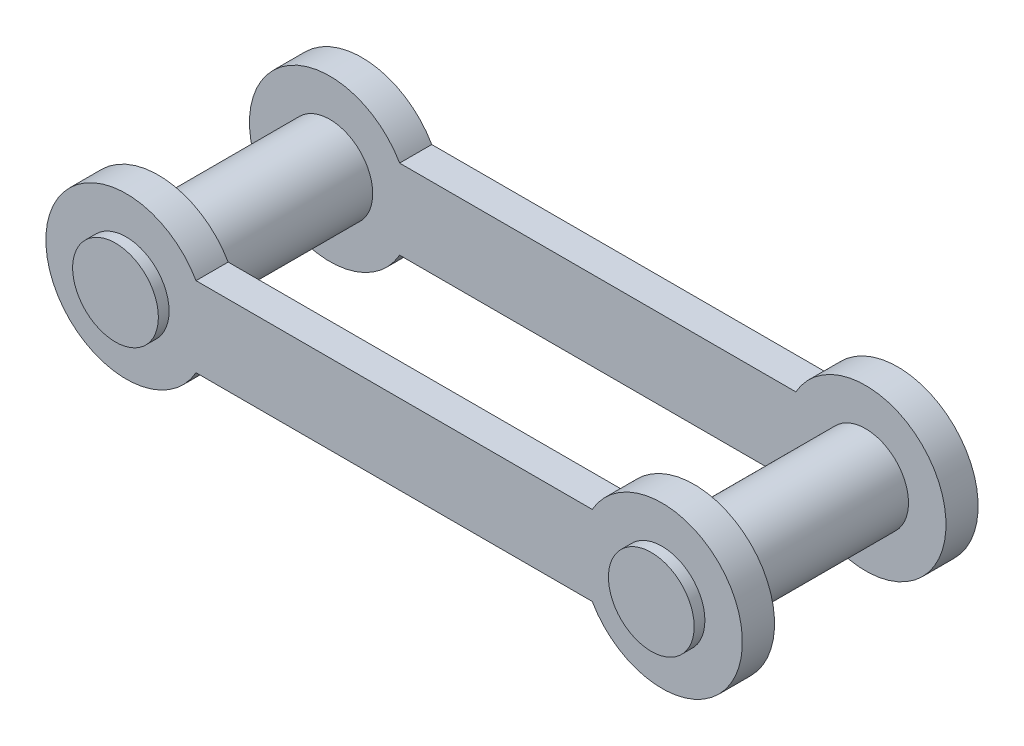
ISO-10303-21;
HEADER;
FILE_DESCRIPTION(('STEP AP214'),'2;1');
FILE_NAME('part.step','',(''),(''),'','','');
FILE_SCHEMA(('AUTOMOTIVE_DESIGN { 1 0 10303 214 1 1 1 1 }'));
ENDSEC;
DATA;
#1=APPLICATION_CONTEXT('core data for automotive mechanical design processes');
#2=APPLICATION_PROTOCOL_DEFINITION('international standard','automotive_design',2000,#1);
#3=PRODUCT_CONTEXT('',#1,'mechanical');
#4=PRODUCT('Part','Part','',(#3));
#5=PRODUCT_RELATED_PRODUCT_CATEGORY('part','',(#4));
#6=PRODUCT_DEFINITION_FORMATION('','',#4);
#7=PRODUCT_DEFINITION_CONTEXT('part definition',#1,'design');
#8=PRODUCT_DEFINITION('design','',#6,#7);
#9=PRODUCT_DEFINITION_SHAPE('','',#8);
#10=(LENGTH_UNIT() NAMED_UNIT(*) SI_UNIT(.MILLI.,.METRE.));
#11=(NAMED_UNIT(*) PLANE_ANGLE_UNIT() SI_UNIT($,.RADIAN.));
#12=(NAMED_UNIT(*) SI_UNIT($,.STERADIAN.) SOLID_ANGLE_UNIT());
#13=UNCERTAINTY_MEASURE_WITH_UNIT(LENGTH_MEASURE(1.E-05),#10,'distance_accuracy_value','');
#14=(GEOMETRIC_REPRESENTATION_CONTEXT(3) GLOBAL_UNCERTAINTY_ASSIGNED_CONTEXT((#13)) GLOBAL_UNIT_ASSIGNED_CONTEXT((#10,
#11,#12)) REPRESENTATION_CONTEXT('',''));
#15=CARTESIAN_POINT('',(0.,0.,0.));
#16=DIRECTION('',(0.,0.,1.));
#17=DIRECTION('',(1.,0.,0.));
#18=AXIS2_PLACEMENT_3D('',#15,#16,#17);
#19=CARTESIAN_POINT('',(-13.0392428409477,1.73580037842723,3.));
#20=DIRECTION('',(0.,0.,1.));
#21=DIRECTION('',(1.,0.,0.));
#22=AXIS2_PLACEMENT_3D('',#19,#20,#21);
#23=PLANE('',#22);
#24=CARTESIAN_POINT('',(-13.0392428409477,1.73580037842723,3.));
#25=DIRECTION('',(0.,0.,1.));
#26=DIRECTION('',(1.,0.,0.));
#27=AXIS2_PLACEMENT_3D('',#24,#25,#26);
#28=CIRCLE('',#27,4.);
#29=CARTESIAN_POINT('',(-9.03924284094771,1.73580037842723,3.));
#30=VERTEX_POINT('',#29);
#31=EDGE_CURVE('E175',#30,#30,#28,.T.);
#32=ORIENTED_EDGE('',*,*,#31,.F.);
#33=EDGE_LOOP('',(#32));
#34=FACE_BOUND('',#33,.T.);
#35=CARTESIAN_POINT('',(-13.0392428409477,1.73580037842723,3.));
#36=DIRECTION('',(0.,0.,1.));
#37=DIRECTION('',(1.,0.,0.));
#38=AXIS2_PLACEMENT_3D('',#35,#36,#37);
#39=CIRCLE('',#38,7.50000000000001);
#40=CARTESIAN_POINT('',(-6.52657961034547,5.45537261791416,3.));
#41=VERTEX_POINT('',#40);
#42=CARTESIAN_POINT('',(-6.52657961034548,-1.98377186105969,3.));
#43=VERTEX_POINT('',#42);
#44=EDGE_CURVE('E179',#41,#43,#39,.T.);
#45=ORIENTED_EDGE('',*,*,#44,.T.);
#46=DIRECTION('',(1.,0.,0.));
#47=VECTOR('',#46,1.);
#48=CARTESIAN_POINT('',(-6.52657961034548,-1.98377186105969,3.));
#49=LINE('',#48,#47);
#50=CARTESIAN_POINT('',(30.4480939284501,-1.98377186105969,3.));
#51=VERTEX_POINT('',#50);
#52=EDGE_CURVE('E83',#43,#51,#49,.T.);
#53=ORIENTED_EDGE('',*,*,#52,.T.);
#54=CARTESIAN_POINT('',(36.9607571590523,1.73580037842723,3.));
#55=DIRECTION('',(0.,0.,1.));
#56=DIRECTION('',(-1.,0.,0.));
#57=AXIS2_PLACEMENT_3D('',#54,#55,#56);
#58=CIRCLE('',#57,7.50000000000001);
#59=CARTESIAN_POINT('',(30.4480939284501,5.45537261791416,3.));
#60=VERTEX_POINT('',#59);
#61=EDGE_CURVE('E182',#51,#60,#58,.T.);
#62=ORIENTED_EDGE('',*,*,#61,.T.);
#63=DIRECTION('',(-1.,0.,0.));
#64=VECTOR('',#63,1.);
#65=CARTESIAN_POINT('',(-6.52657961034547,5.45537261791416,3.));
#66=LINE('',#65,#64);
#67=EDGE_CURVE('E51',#60,#41,#66,.T.);
#68=ORIENTED_EDGE('',*,*,#67,.T.);
#69=EDGE_LOOP('',(#45,#53,#62,#68));
#70=FACE_BOUND('',#69,.T.);
#71=CARTESIAN_POINT('',(36.9607571590523,1.73580037842723,3.));
#72=DIRECTION('',(0.,0.,1.));
#73=DIRECTION('',(-1.,0.,0.));
#74=AXIS2_PLACEMENT_3D('',#71,#72,#73);
#75=CIRCLE('',#74,4.);
#76=CARTESIAN_POINT('',(32.9607571590523,1.73580037842723,3.));
#77=VERTEX_POINT('',#76);
#78=EDGE_CURVE('E172',#77,#77,#75,.T.);
#79=ORIENTED_EDGE('',*,*,#78,.F.);
#80=EDGE_LOOP('',(#79));
#81=FACE_BOUND('',#80,.T.);
#82=ADVANCED_FACE('F34',(#34,#70,#81),#23,.T.);
#83=CARTESIAN_POINT('',(-13.0392428409477,1.73580037842723,0.));
#84=DIRECTION('',(0.,0.,1.));
#85=DIRECTION('',(1.,0.,0.));
#86=AXIS2_PLACEMENT_3D('',#83,#84,#85);
#87=PLANE('',#86);
#88=CARTESIAN_POINT('',(-13.0392428409477,1.73580037842723,0.));
#89=DIRECTION('',(0.,0.,1.));
#90=DIRECTION('',(1.,0.,0.));
#91=AXIS2_PLACEMENT_3D('',#88,#89,#90);
#92=CIRCLE('',#91,7.50000000000001);
#93=CARTESIAN_POINT('',(-6.52657961034547,5.45537261791416,0.));
#94=VERTEX_POINT('',#93);
#95=CARTESIAN_POINT('',(-6.52657961034548,-1.98377186105969,0.));
#96=VERTEX_POINT('',#95);
#97=EDGE_CURVE('E178',#94,#96,#92,.T.);
#98=ORIENTED_EDGE('',*,*,#97,.F.);
#99=DIRECTION('',(-1.,0.,0.));
#100=VECTOR('',#99,1.);
#101=CARTESIAN_POINT('',(-6.52657961034547,5.45537261791416,0.));
#102=LINE('',#101,#100);
#103=CARTESIAN_POINT('',(30.4480939284501,5.45537261791416,0.));
#104=VERTEX_POINT('',#103);
#105=EDGE_CURVE('E75',#104,#94,#102,.T.);
#106=ORIENTED_EDGE('',*,*,#105,.F.);
#107=CARTESIAN_POINT('',(36.9607571590523,1.73580037842723,0.));
#108=DIRECTION('',(0.,0.,1.));
#109=DIRECTION('',(-1.,0.,0.));
#110=AXIS2_PLACEMENT_3D('',#107,#108,#109);
#111=CIRCLE('',#110,7.50000000000001);
#112=CARTESIAN_POINT('',(30.4480939284501,-1.98377186105969,0.));
#113=VERTEX_POINT('',#112);
#114=EDGE_CURVE('E69',#113,#104,#111,.T.);
#115=ORIENTED_EDGE('',*,*,#114,.F.);
#116=DIRECTION('',(1.,0.,0.));
#117=VECTOR('',#116,1.);
#118=CARTESIAN_POINT('',(-6.52657961034548,-1.98377186105969,0.));
#119=LINE('',#118,#117);
#120=EDGE_CURVE('E188',#96,#113,#119,.T.);
#121=ORIENTED_EDGE('',*,*,#120,.F.);
#122=EDGE_LOOP('',(#98,#106,#115,#121));
#123=FACE_BOUND('',#122,.T.);
#124=CARTESIAN_POINT('',(-13.0392428409477,1.73580037842723,0.));
#125=DIRECTION('',(0.,0.,1.));
#126=DIRECTION('',(1.,0.,0.));
#127=AXIS2_PLACEMENT_3D('',#124,#125,#126);
#128=CIRCLE('',#127,4.);
#129=CARTESIAN_POINT('',(-9.03924284094771,1.73580037842723,0.));
#130=VERTEX_POINT('',#129);
#131=EDGE_CURVE('E169',#130,#130,#128,.T.);
#132=ORIENTED_EDGE('',*,*,#131,.T.);
#133=EDGE_LOOP('',(#132));
#134=FACE_BOUND('',#133,.T.);
#135=CARTESIAN_POINT('',(36.9607571590523,1.73580037842723,0.));
#136=DIRECTION('',(0.,0.,1.));
#137=DIRECTION('',(1.,0.,0.));
#138=AXIS2_PLACEMENT_3D('',#135,#136,#137);
#139=CIRCLE('',#138,4.);
#140=CARTESIAN_POINT('',(40.9607571590523,1.73580037842723,0.));
#141=VERTEX_POINT('',#140);
#142=EDGE_CURVE('E160',#141,#141,#139,.T.);
#143=ORIENTED_EDGE('',*,*,#142,.T.);
#144=EDGE_LOOP('',(#143));
#145=FACE_BOUND('',#144,.T.);
#146=ADVANCED_FACE('F212',(#123,#134,#145),#87,.F.);
#147=CARTESIAN_POINT('',(-13.0392428409477,1.73580037842723,3.));
#148=DIRECTION('',(0.,0.,-1.));
#149=DIRECTION('',(-1.,0.,0.));
#150=AXIS2_PLACEMENT_3D('',#147,#148,#149);
#151=CYLINDRICAL_SURFACE('',#150,7.50000000000001);
#152=ORIENTED_EDGE('',*,*,#97,.T.);
#153=DIRECTION('',(0.,0.,-1.));
#154=VECTOR('',#153,1.);
#155=CARTESIAN_POINT('',(-6.52657961034548,-1.98377186105969,3.));
#156=LINE('',#155,#154);
#157=EDGE_CURVE('E197',#43,#96,#156,.T.);
#158=ORIENTED_EDGE('',*,*,#157,.F.);
#159=ORIENTED_EDGE('',*,*,#44,.F.);
#160=DIRECTION('',(0.,0.,-1.));
#161=VECTOR('',#160,1.);
#162=CARTESIAN_POINT('',(-6.52657961034547,5.45537261791416,3.));
#163=LINE('',#162,#161);
#164=EDGE_CURVE('E185',#41,#94,#163,.T.);
#165=ORIENTED_EDGE('',*,*,#164,.T.);
#166=EDGE_LOOP('',(#152,#158,#159,#165));
#167=FACE_BOUND('',#166,.T.);
#168=ADVANCED_FACE('F36',(#167),#151,.T.);
#169=CARTESIAN_POINT('',(-6.52657961034548,-1.98377186105969,3.));
#170=DIRECTION('',(0.,1.,0.));
#171=DIRECTION('',(0.,0.,1.));
#172=AXIS2_PLACEMENT_3D('',#169,#170,#171);
#173=PLANE('',#172);
#174=ORIENTED_EDGE('',*,*,#120,.T.);
#175=DIRECTION('',(0.,0.,-1.));
#176=VECTOR('',#175,1.);
#177=CARTESIAN_POINT('',(30.4480939284501,-1.98377186105969,3.));
#178=LINE('',#177,#176);
#179=EDGE_CURVE('E195',#51,#113,#178,.T.);
#180=ORIENTED_EDGE('',*,*,#179,.F.);
#181=ORIENTED_EDGE('',*,*,#52,.F.);
#182=ORIENTED_EDGE('',*,*,#157,.T.);
#183=EDGE_LOOP('',(#174,#180,#181,#182));
#184=FACE_BOUND('',#183,.T.);
#185=ADVANCED_FACE('F231',(#184),#173,.F.);
#186=CARTESIAN_POINT('',(36.9607571590523,1.73580037842723,3.));
#187=DIRECTION('',(0.,0.,-1.));
#188=DIRECTION('',(-1.,0.,0.));
#189=AXIS2_PLACEMENT_3D('',#186,#187,#188);
#190=CYLINDRICAL_SURFACE('',#189,7.50000000000001);
#191=ORIENTED_EDGE('',*,*,#114,.T.);
#192=DIRECTION('',(0.,0.,-1.));
#193=VECTOR('',#192,1.);
#194=CARTESIAN_POINT('',(30.4480939284501,5.45537261791416,3.));
#195=LINE('',#194,#193);
#196=EDGE_CURVE('E193',#60,#104,#195,.T.);
#197=ORIENTED_EDGE('',*,*,#196,.F.);
#198=ORIENTED_EDGE('',*,*,#61,.F.);
#199=ORIENTED_EDGE('',*,*,#179,.T.);
#200=EDGE_LOOP('',(#191,#197,#198,#199));
#201=FACE_BOUND('',#200,.T.);
#202=ADVANCED_FACE('F229',(#201),#190,.T.);
#203=CARTESIAN_POINT('',(-6.52657961034547,5.45537261791416,3.));
#204=DIRECTION('',(0.,-1.,0.));
#205=DIRECTION('',(0.,0.,-1.));
#206=AXIS2_PLACEMENT_3D('',#203,#204,#205);
#207=PLANE('',#206);
#208=ORIENTED_EDGE('',*,*,#105,.T.);
#209=ORIENTED_EDGE('',*,*,#164,.F.);
#210=ORIENTED_EDGE('',*,*,#67,.F.);
#211=ORIENTED_EDGE('',*,*,#196,.T.);
#212=EDGE_LOOP('',(#208,#209,#210,#211));
#213=FACE_BOUND('',#212,.T.);
#214=ADVANCED_FACE('F225',(#213),#207,.F.);
#215=CARTESIAN_POINT('',(-13.0392428409477,1.73580037842723,-1.));
#216=DIRECTION('',(0.,0.,1.));
#217=DIRECTION('',(1.,0.,0.));
#218=AXIS2_PLACEMENT_3D('',#215,#216,#217);
#219=PLANE('',#218);
#220=CARTESIAN_POINT('',(-13.0392428409477,1.73580037842723,-1.));
#221=DIRECTION('',(0.,0.,1.));
#222=DIRECTION('',(1.,0.,0.));
#223=AXIS2_PLACEMENT_3D('',#220,#221,#222);
#224=CIRCLE('',#223,4.);
#225=CARTESIAN_POINT('',(-9.03924284094771,1.73580037842723,-1.));
#226=VERTEX_POINT('',#225);
#227=EDGE_CURVE('E166',#226,#226,#224,.T.);
#228=ORIENTED_EDGE('',*,*,#227,.F.);
#229=EDGE_LOOP('',(#228));
#230=FACE_BOUND('',#229,.T.);
#231=ADVANCED_FACE('F228',(#230),#219,.F.);
#232=CARTESIAN_POINT('',(-13.0392428409477,1.73580037842723,-1.));
#233=DIRECTION('',(0.,0.,1.));
#234=DIRECTION('',(1.,0.,0.));
#235=AXIS2_PLACEMENT_3D('',#232,#233,#234);
#236=CYLINDRICAL_SURFACE('',#235,4.);
#237=ORIENTED_EDGE('',*,*,#227,.T.);
#238=EDGE_LOOP('',(#237));
#239=FACE_BOUND('',#238,.T.);
#240=ORIENTED_EDGE('',*,*,#131,.F.);
#241=EDGE_LOOP('',(#240));
#242=FACE_BOUND('',#241,.T.);
#243=ADVANCED_FACE('F338',(#239,#242),#236,.T.);
#244=CARTESIAN_POINT('',(-13.0392428409477,1.73580037842723,19.));
#245=DIRECTION('',(0.,0.,-1.));
#246=DIRECTION('',(-1.,0.,0.));
#247=AXIS2_PLACEMENT_3D('',#244,#245,#246);
#248=CIRCLE('',#247,4.);
#249=CARTESIAN_POINT('',(-17.0392428409477,1.73580037842723,19.));
#250=VERTEX_POINT('',#249);
#251=EDGE_CURVE('E11',#250,#250,#248,.F.);
#252=ORIENTED_EDGE('',*,*,#251,.F.);
#253=EDGE_LOOP('',(#252));
#254=FACE_BOUND('',#253,.T.);
#255=ORIENTED_EDGE('',*,*,#31,.T.);
#256=EDGE_LOOP('',(#255));
#257=FACE_BOUND('',#256,.T.);
#258=ADVANCED_FACE('F222',(#254,#257),#236,.T.);
#259=CARTESIAN_POINT('',(36.9607571590523,1.73580037842723,-1.));
#260=DIRECTION('',(0.,0.,1.));
#261=DIRECTION('',(1.,0.,0.));
#262=AXIS2_PLACEMENT_3D('',#259,#260,#261);
#263=PLANE('',#262);
#264=CARTESIAN_POINT('',(36.9607571590523,1.73580037842723,-1.));
#265=DIRECTION('',(0.,0.,1.));
#266=DIRECTION('',(1.,0.,0.));
#267=AXIS2_PLACEMENT_3D('',#264,#265,#266);
#268=CIRCLE('',#267,4.);
#269=CARTESIAN_POINT('',(40.9607571590523,1.73580037842723,-1.));
#270=VERTEX_POINT('',#269);
#271=EDGE_CURVE('E157',#270,#270,#268,.T.);
#272=ORIENTED_EDGE('',*,*,#271,.F.);
#273=EDGE_LOOP('',(#272));
#274=FACE_BOUND('',#273,.T.);
#275=ADVANCED_FACE('F247',(#274),#263,.F.);
#276=CARTESIAN_POINT('',(36.9607571590523,1.73580037842723,-1.));
#277=DIRECTION('',(0.,0.,1.));
#278=DIRECTION('',(1.,0.,0.));
#279=AXIS2_PLACEMENT_3D('',#276,#277,#278);
#280=CYLINDRICAL_SURFACE('',#279,4.);
#281=ORIENTED_EDGE('',*,*,#271,.T.);
#282=EDGE_LOOP('',(#281));
#283=FACE_BOUND('',#282,.T.);
#284=ORIENTED_EDGE('',*,*,#142,.F.);
#285=EDGE_LOOP('',(#284));
#286=FACE_BOUND('',#285,.T.);
#287=ADVANCED_FACE('F206',(#283,#286),#280,.T.);
#288=CARTESIAN_POINT('',(36.9607571590523,1.73580037842723,19.));
#289=DIRECTION('',(0.,0.,-1.));
#290=DIRECTION('',(-1.,0.,0.));
#291=AXIS2_PLACEMENT_3D('',#288,#289,#290);
#292=CIRCLE('',#291,4.);
#293=CARTESIAN_POINT('',(32.9607571590523,1.73580037842723,19.));
#294=VERTEX_POINT('',#293);
#295=EDGE_CURVE('E43',#294,#294,#292,.F.);
#296=ORIENTED_EDGE('',*,*,#295,.F.);
#297=EDGE_LOOP('',(#296));
#298=FACE_BOUND('',#297,.T.);
#299=ORIENTED_EDGE('',*,*,#78,.T.);
#300=EDGE_LOOP('',(#299));
#301=FACE_BOUND('',#300,.T.);
#302=ADVANCED_FACE('F203',(#298,#301),#280,.T.);
#303=CARTESIAN_POINT('',(-13.0392428409477,1.73580037842723,19.));
#304=DIRECTION('',(0.,0.,1.));
#305=DIRECTION('',(1.,0.,0.));
#306=AXIS2_PLACEMENT_3D('',#303,#304,#305);
#307=CYLINDRICAL_SURFACE('',#306,7.50000000000001);
#308=CARTESIAN_POINT('',(-13.0392428409477,1.73580037842723,22.));
#309=DIRECTION('',(0.,0.,1.));
#310=DIRECTION('',(1.,0.,0.));
#311=AXIS2_PLACEMENT_3D('',#308,#309,#310);
#312=CIRCLE('',#311,7.50000000000001);
#313=CARTESIAN_POINT('',(-6.52657961034547,5.45537261791416,22.));
#314=VERTEX_POINT('',#313);
#315=CARTESIAN_POINT('',(-6.52657961034548,-1.98377186105969,22.));
#316=VERTEX_POINT('',#315);
#317=EDGE_CURVE('E116',#314,#316,#312,.T.);
#318=ORIENTED_EDGE('',*,*,#317,.F.);
#319=DIRECTION('',(0.,0.,1.));
#320=VECTOR('',#319,1.);
#321=CARTESIAN_POINT('',(-6.52657961034547,5.45537261791416,19.));
#322=LINE('',#321,#320);
#323=CARTESIAN_POINT('',(-6.52657961034547,5.45537261791416,19.));
#324=VERTEX_POINT('',#323);
#325=EDGE_CURVE('E110',#324,#314,#322,.T.);
#326=ORIENTED_EDGE('',*,*,#325,.F.);
#327=CARTESIAN_POINT('',(-13.0392428409477,1.73580037842723,19.));
#328=DIRECTION('',(0.,0.,1.));
#329=DIRECTION('',(1.,0.,0.));
#330=AXIS2_PLACEMENT_3D('',#327,#328,#329);
#331=CIRCLE('',#330,7.50000000000001);
#332=CARTESIAN_POINT('',(-6.52657961034548,-1.98377186105969,19.));
#333=VERTEX_POINT('',#332);
#334=EDGE_CURVE('E113',#324,#333,#331,.T.);
#335=ORIENTED_EDGE('',*,*,#334,.T.);
#336=DIRECTION('',(0.,0.,1.));
#337=VECTOR('',#336,1.);
#338=CARTESIAN_POINT('',(-6.52657961034548,-1.98377186105969,19.));
#339=LINE('',#338,#337);
#340=EDGE_CURVE('E141',#333,#316,#339,.T.);
#341=ORIENTED_EDGE('',*,*,#340,.T.);
#342=EDGE_LOOP('',(#318,#326,#335,#341));
#343=FACE_BOUND('',#342,.T.);
#344=ADVANCED_FACE('F112',(#343),#307,.T.);
#345=CARTESIAN_POINT('',(-6.52657961034547,5.45537261791416,19.));
#346=DIRECTION('',(0.,1.,0.));
#347=DIRECTION('',(0.,0.,1.));
#348=AXIS2_PLACEMENT_3D('',#345,#346,#347);
#349=PLANE('',#348);
#350=DIRECTION('',(-1.,0.,0.));
#351=VECTOR('',#350,1.);
#352=CARTESIAN_POINT('',(-6.52657961034547,5.45537261791416,22.));
#353=LINE('',#352,#351);
#354=CARTESIAN_POINT('',(30.4480939284501,5.45537261791416,22.));
#355=VERTEX_POINT('',#354);
#356=EDGE_CURVE('E143',#355,#314,#353,.T.);
#357=ORIENTED_EDGE('',*,*,#356,.F.);
#358=DIRECTION('',(0.,0.,1.));
#359=VECTOR('',#358,1.);
#360=CARTESIAN_POINT('',(30.4480939284501,5.45537261791416,19.));
#361=LINE('',#360,#359);
#362=CARTESIAN_POINT('',(30.4480939284501,5.45537261791416,19.));
#363=VERTEX_POINT('',#362);
#364=EDGE_CURVE('E122',#363,#355,#361,.T.);
#365=ORIENTED_EDGE('',*,*,#364,.F.);
#366=DIRECTION('',(-1.,0.,0.));
#367=VECTOR('',#366,1.);
#368=CARTESIAN_POINT('',(-6.52657961034547,5.45537261791416,19.));
#369=LINE('',#368,#367);
#370=EDGE_CURVE('E128',#363,#324,#369,.T.);
#371=ORIENTED_EDGE('',*,*,#370,.T.);
#372=ORIENTED_EDGE('',*,*,#325,.T.);
#373=EDGE_LOOP('',(#357,#365,#371,#372));
#374=FACE_BOUND('',#373,.T.);
#375=ADVANCED_FACE('F134',(#374),#349,.T.);
#376=CARTESIAN_POINT('',(36.9607571590523,1.73580037842723,19.));
#377=DIRECTION('',(0.,0.,1.));
#378=DIRECTION('',(1.,0.,0.));
#379=AXIS2_PLACEMENT_3D('',#376,#377,#378);
#380=CYLINDRICAL_SURFACE('',#379,7.50000000000001);
#381=CARTESIAN_POINT('',(36.9607571590523,1.73580037842723,22.));
#382=DIRECTION('',(0.,0.,1.));
#383=DIRECTION('',(-1.,0.,0.));
#384=AXIS2_PLACEMENT_3D('',#381,#382,#383);
#385=CIRCLE('',#384,7.50000000000001);
#386=CARTESIAN_POINT('',(30.4480939284501,-1.98377186105969,22.));
#387=VERTEX_POINT('',#386);
#388=EDGE_CURVE('E146',#387,#355,#385,.T.);
#389=ORIENTED_EDGE('',*,*,#388,.F.);
#390=DIRECTION('',(0.,0.,1.));
#391=VECTOR('',#390,1.);
#392=CARTESIAN_POINT('',(30.4480939284501,-1.98377186105969,19.));
#393=LINE('',#392,#391);
#394=CARTESIAN_POINT('',(30.4480939284501,-1.98377186105969,19.));
#395=VERTEX_POINT('',#394);
#396=EDGE_CURVE('E152',#395,#387,#393,.T.);
#397=ORIENTED_EDGE('',*,*,#396,.F.);
#398=CARTESIAN_POINT('',(36.9607571590523,1.73580037842723,19.));
#399=DIRECTION('',(0.,0.,1.));
#400=DIRECTION('',(-1.,0.,0.));
#401=AXIS2_PLACEMENT_3D('',#398,#399,#400);
#402=CIRCLE('',#401,7.50000000000001);
#403=EDGE_CURVE('E135',#395,#363,#402,.T.);
#404=ORIENTED_EDGE('',*,*,#403,.T.);
#405=ORIENTED_EDGE('',*,*,#364,.T.);
#406=EDGE_LOOP('',(#389,#397,#404,#405));
#407=FACE_BOUND('',#406,.T.);
#408=ADVANCED_FACE('F285',(#407),#380,.T.);
#409=CARTESIAN_POINT('',(-6.52657961034548,-1.98377186105969,19.));
#410=DIRECTION('',(0.,-1.,0.));
#411=DIRECTION('',(0.,0.,-1.));
#412=AXIS2_PLACEMENT_3D('',#409,#410,#411);
#413=PLANE('',#412);
#414=DIRECTION('',(1.,0.,0.));
#415=VECTOR('',#414,1.);
#416=CARTESIAN_POINT('',(-6.52657961034548,-1.98377186105969,22.));
#417=LINE('',#416,#415);
#418=EDGE_CURVE('E132',#316,#387,#417,.T.);
#419=ORIENTED_EDGE('',*,*,#418,.F.);
#420=ORIENTED_EDGE('',*,*,#340,.F.);
#421=DIRECTION('',(1.,0.,0.));
#422=VECTOR('',#421,1.);
#423=CARTESIAN_POINT('',(-6.52657961034548,-1.98377186105969,19.));
#424=LINE('',#423,#422);
#425=EDGE_CURVE('E131',#333,#395,#424,.T.);
#426=ORIENTED_EDGE('',*,*,#425,.T.);
#427=ORIENTED_EDGE('',*,*,#396,.T.);
#428=EDGE_LOOP('',(#419,#420,#426,#427));
#429=FACE_BOUND('',#428,.T.);
#430=ADVANCED_FACE('F282',(#429),#413,.T.);
#431=CARTESIAN_POINT('',(-13.0392428409477,1.73580037842723,19.));
#432=DIRECTION('',(0.,0.,-1.));
#433=DIRECTION('',(1.,0.,0.));
#434=AXIS2_PLACEMENT_3D('',#431,#432,#433);
#435=PLANE('',#434);
#436=ORIENTED_EDGE('',*,*,#295,.T.);
#437=EDGE_LOOP('',(#436));
#438=FACE_BOUND('',#437,.T.);
#439=ORIENTED_EDGE('',*,*,#251,.T.);
#440=EDGE_LOOP('',(#439));
#441=FACE_BOUND('',#440,.T.);
#442=ORIENTED_EDGE('',*,*,#334,.F.);
#443=ORIENTED_EDGE('',*,*,#370,.F.);
#444=ORIENTED_EDGE('',*,*,#403,.F.);
#445=ORIENTED_EDGE('',*,*,#425,.F.);
#446=EDGE_LOOP('',(#442,#443,#444,#445));
#447=FACE_BOUND('',#446,.T.);
#448=ADVANCED_FACE('F126',(#438,#441,#447),#435,.T.);
#449=CARTESIAN_POINT('',(-13.0392428409477,1.73580037842723,22.));
#450=DIRECTION('',(0.,0.,-1.));
#451=DIRECTION('',(1.,0.,0.));
#452=AXIS2_PLACEMENT_3D('',#449,#450,#451);
#453=PLANE('',#452);
#454=CARTESIAN_POINT('',(36.9607571590523,1.73580037842723,22.));
#455=DIRECTION('',(0.,0.,1.));
#456=DIRECTION('',(-1.,0.,0.));
#457=AXIS2_PLACEMENT_3D('',#454,#455,#456);
#458=CIRCLE('',#457,4.);
#459=CARTESIAN_POINT('',(32.9607571590523,1.73580037842723,22.));
#460=VERTEX_POINT('',#459);
#461=EDGE_CURVE('E268',#460,#460,#458,.T.);
#462=ORIENTED_EDGE('',*,*,#461,.F.);
#463=EDGE_LOOP('',(#462));
#464=FACE_BOUND('',#463,.T.);
#465=CARTESIAN_POINT('',(-13.0392428409477,1.73580037842723,22.));
#466=DIRECTION('',(0.,0.,1.));
#467=DIRECTION('',(1.,0.,0.));
#468=AXIS2_PLACEMENT_3D('',#465,#466,#467);
#469=CIRCLE('',#468,4.);
#470=CARTESIAN_POINT('',(-9.03924284094771,1.73580037842723,22.));
#471=VERTEX_POINT('',#470);
#472=EDGE_CURVE('E144',#471,#471,#469,.T.);
#473=ORIENTED_EDGE('',*,*,#472,.F.);
#474=EDGE_LOOP('',(#473));
#475=FACE_BOUND('',#474,.T.);
#476=ORIENTED_EDGE('',*,*,#317,.T.);
#477=ORIENTED_EDGE('',*,*,#418,.T.);
#478=ORIENTED_EDGE('',*,*,#388,.T.);
#479=ORIENTED_EDGE('',*,*,#356,.T.);
#480=EDGE_LOOP('',(#476,#477,#478,#479));
#481=FACE_BOUND('',#480,.T.);
#482=ADVANCED_FACE('F275',(#464,#475,#481),#453,.F.);
#483=CARTESIAN_POINT('',(-13.0392428409477,1.73580037842723,23.));
#484=DIRECTION('',(0.,0.,1.));
#485=DIRECTION('',(1.,0.,0.));
#486=AXIS2_PLACEMENT_3D('',#483,#484,#485);
#487=PLANE('',#486);
#488=CARTESIAN_POINT('',(-13.0392428409477,1.73580037842723,23.));
#489=DIRECTION('',(0.,0.,1.));
#490=DIRECTION('',(1.,0.,0.));
#491=AXIS2_PLACEMENT_3D('',#488,#489,#490);
#492=CIRCLE('',#491,4.);
#493=CARTESIAN_POINT('',(-9.03924284094771,1.73580037842723,23.));
#494=VERTEX_POINT('',#493);
#495=EDGE_CURVE('E163',#494,#494,#492,.T.);
#496=ORIENTED_EDGE('',*,*,#495,.T.);
#497=EDGE_LOOP('',(#496));
#498=FACE_BOUND('',#497,.T.);
#499=ADVANCED_FACE('F278',(#498),#487,.T.);
#500=ORIENTED_EDGE('',*,*,#495,.F.);
#501=EDGE_LOOP('',(#500));
#502=FACE_BOUND('',#501,.T.);
#503=ORIENTED_EDGE('',*,*,#472,.T.);
#504=EDGE_LOOP('',(#503));
#505=FACE_BOUND('',#504,.T.);
#506=ADVANCED_FACE('F261',(#502,#505),#236,.T.);
#507=CARTESIAN_POINT('',(36.9607571590523,1.73580037842723,23.));
#508=DIRECTION('',(0.,0.,1.));
#509=DIRECTION('',(1.,0.,0.));
#510=AXIS2_PLACEMENT_3D('',#507,#508,#509);
#511=PLANE('',#510);
#512=CARTESIAN_POINT('',(36.9607571590523,1.73580037842723,23.));
#513=DIRECTION('',(0.,0.,1.));
#514=DIRECTION('',(1.,0.,0.));
#515=AXIS2_PLACEMENT_3D('',#512,#513,#514);
#516=CIRCLE('',#515,4.);
#517=CARTESIAN_POINT('',(40.9607571590523,1.73580037842723,23.));
#518=VERTEX_POINT('',#517);
#519=EDGE_CURVE('E121',#518,#518,#516,.T.);
#520=ORIENTED_EDGE('',*,*,#519,.T.);
#521=EDGE_LOOP('',(#520));
#522=FACE_BOUND('',#521,.T.);
#523=ADVANCED_FACE('F256',(#522),#511,.T.);
#524=ORIENTED_EDGE('',*,*,#519,.F.);
#525=EDGE_LOOP('',(#524));
#526=FACE_BOUND('',#525,.T.);
#527=ORIENTED_EDGE('',*,*,#461,.T.);
#528=EDGE_LOOP('',(#527));
#529=FACE_BOUND('',#528,.T.);
#530=ADVANCED_FACE('F208',(#526,#529),#280,.T.);
#531=CLOSED_SHELL('',(#82,#146,#168,#185,#202,#214,#231,#243,#258,#275,#287,#302,#344,#375,#408,
#430,#448,#482,#499,#506,#523,#530));
#532=MANIFOLD_SOLID_BREP('B2',#531);
#533=ADVANCED_BREP_SHAPE_REPRESENTATION('',(#18,#532),#14);
#534=SHAPE_DEFINITION_REPRESENTATION(#9,#533);
ENDSEC;
END-ISO-10303-21;
